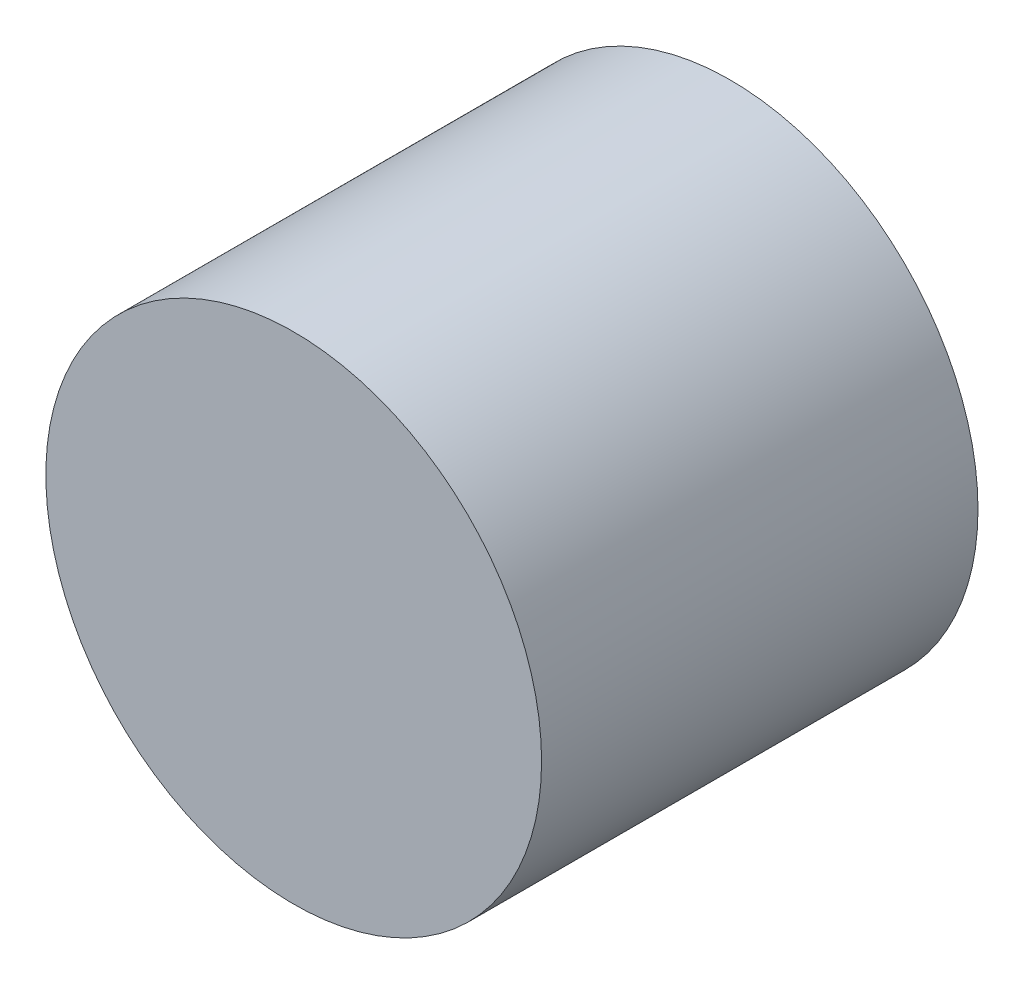
ISO-10303-21;
HEADER;
FILE_DESCRIPTION(('STEP AP214'),'2;1');
FILE_NAME('part.step','',(''),(''),'','','');
FILE_SCHEMA(('AUTOMOTIVE_DESIGN { 1 0 10303 214 1 1 1 1 }'));
ENDSEC;
DATA;
#1=APPLICATION_CONTEXT('core data for automotive mechanical design processes');
#2=APPLICATION_PROTOCOL_DEFINITION('international standard','automotive_design',2000,#1);
#3=PRODUCT_CONTEXT('',#1,'mechanical');
#4=PRODUCT('Part','Part','',(#3));
#5=PRODUCT_RELATED_PRODUCT_CATEGORY('part','',(#4));
#6=PRODUCT_DEFINITION_FORMATION('','',#4);
#7=PRODUCT_DEFINITION_CONTEXT('part definition',#1,'design');
#8=PRODUCT_DEFINITION('design','',#6,#7);
#9=PRODUCT_DEFINITION_SHAPE('','',#8);
#10=(LENGTH_UNIT() NAMED_UNIT(*) SI_UNIT(.MILLI.,.METRE.));
#11=(NAMED_UNIT(*) PLANE_ANGLE_UNIT() SI_UNIT($,.RADIAN.));
#12=(NAMED_UNIT(*) SI_UNIT($,.STERADIAN.) SOLID_ANGLE_UNIT());
#13=UNCERTAINTY_MEASURE_WITH_UNIT(LENGTH_MEASURE(1.E-05),#10,'distance_accuracy_value','');
#14=(GEOMETRIC_REPRESENTATION_CONTEXT(3) GLOBAL_UNCERTAINTY_ASSIGNED_CONTEXT((#13)) GLOBAL_UNIT_ASSIGNED_CONTEXT((#10,
#11,#12)) REPRESENTATION_CONTEXT('',''));
#15=CARTESIAN_POINT('',(0.,0.,0.));
#16=DIRECTION('',(0.,0.,1.));
#17=DIRECTION('',(1.,0.,0.));
#18=AXIS2_PLACEMENT_3D('',#15,#16,#17);
#19=CARTESIAN_POINT('',(17.0041760255828,109.694558522487,80.));
#20=DIRECTION('',(0.,0.,-1.));
#21=DIRECTION('',(-1.,0.,0.));
#22=AXIS2_PLACEMENT_3D('',#19,#20,#21);
#23=CYLINDRICAL_SURFACE('',#22,45.4384705974764);
#24=CARTESIAN_POINT('',(17.0041760255828,109.694558522487,80.));
#25=DIRECTION('',(0.,0.,1.));
#26=DIRECTION('',(1.,0.,0.));
#27=AXIS2_PLACEMENT_3D('',#24,#25,#26);
#28=CIRCLE('',#27,45.4384705974764);
#29=CARTESIAN_POINT('',(62.4426466230592,109.694558522487,80.));
#30=VERTEX_POINT('',#29);
#31=EDGE_CURVE('E10',#30,#30,#28,.T.);
#32=ORIENTED_EDGE('',*,*,#31,.F.);
#33=EDGE_LOOP('',(#32));
#34=FACE_BOUND('',#33,.T.);
#35=CARTESIAN_POINT('',(17.0041760255828,109.694558522487,0.));
#36=DIRECTION('',(0.,0.,1.));
#37=DIRECTION('',(1.,0.,0.));
#38=AXIS2_PLACEMENT_3D('',#35,#36,#37);
#39=CIRCLE('',#38,45.4384705974764);
#40=CARTESIAN_POINT('',(62.4426466230592,109.694558522487,0.));
#41=VERTEX_POINT('',#40);
#42=EDGE_CURVE('E40',#41,#41,#39,.T.);
#43=ORIENTED_EDGE('',*,*,#42,.T.);
#44=EDGE_LOOP('',(#43));
#45=FACE_BOUND('',#44,.T.);
#46=ADVANCED_FACE('F37',(#34,#45),#23,.T.);
#47=CARTESIAN_POINT('',(17.0041760255828,109.694558522487,80.));
#48=DIRECTION('',(0.,0.,1.));
#49=DIRECTION('',(1.,0.,0.));
#50=AXIS2_PLACEMENT_3D('',#47,#48,#49);
#51=PLANE('',#50);
#52=ORIENTED_EDGE('',*,*,#31,.T.);
#53=EDGE_LOOP('',(#52));
#54=FACE_BOUND('',#53,.T.);
#55=ADVANCED_FACE('F52',(#54),#51,.T.);
#56=CARTESIAN_POINT('',(17.0041760255828,109.694558522487,0.));
#57=DIRECTION('',(0.,0.,1.));
#58=DIRECTION('',(1.,0.,0.));
#59=AXIS2_PLACEMENT_3D('',#56,#57,#58);
#60=PLANE('',#59);
#61=ORIENTED_EDGE('',*,*,#42,.F.);
#62=EDGE_LOOP('',(#61));
#63=FACE_BOUND('',#62,.T.);
#64=ADVANCED_FACE('F50',(#63),#60,.F.);
#65=CLOSED_SHELL('',(#46,#55,#64));
#66=MANIFOLD_SOLID_BREP('B2',#65);
#67=ADVANCED_BREP_SHAPE_REPRESENTATION('',(#18,#66),#14);
#68=SHAPE_DEFINITION_REPRESENTATION(#9,#67);
ENDSEC;
END-ISO-10303-21;
